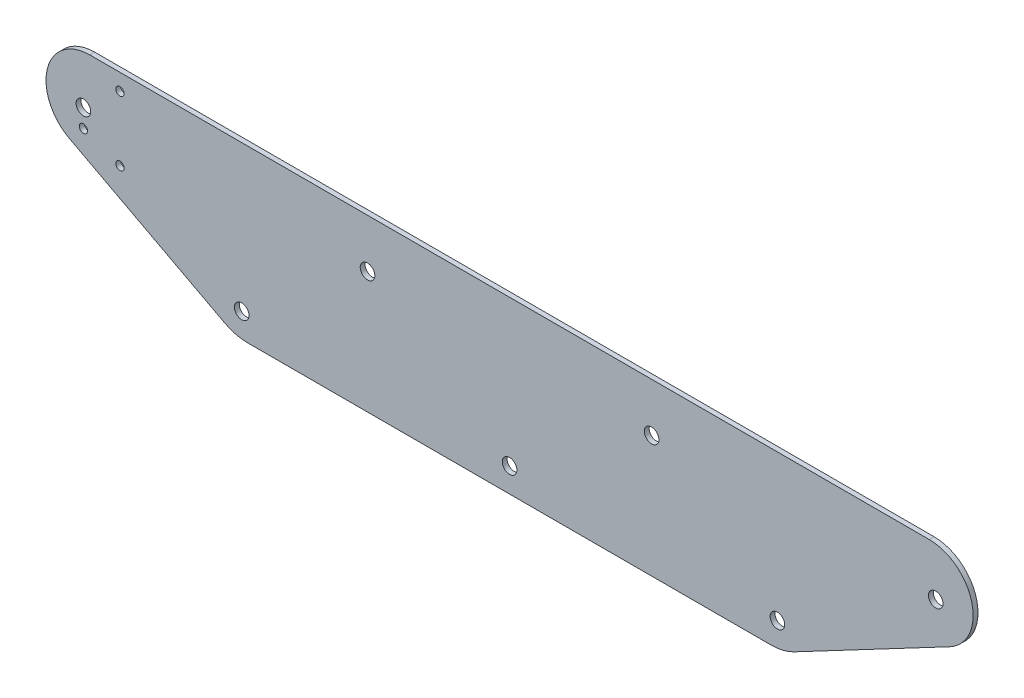
ISO-10303-21;
HEADER;
FILE_DESCRIPTION(('STEP AP214'),'2;1');
FILE_NAME('part.step','',(''),(''),'','','');
FILE_SCHEMA(('AUTOMOTIVE_DESIGN { 1 0 10303 214 1 1 1 1 }'));
ENDSEC;
DATA;
#1=APPLICATION_CONTEXT('core data for automotive mechanical design processes');
#2=APPLICATION_PROTOCOL_DEFINITION('international standard','automotive_design',2000,#1);
#3=PRODUCT_CONTEXT('',#1,'mechanical');
#4=PRODUCT('Part','Part','',(#3));
#5=PRODUCT_RELATED_PRODUCT_CATEGORY('part','',(#4));
#6=PRODUCT_DEFINITION_FORMATION('','',#4);
#7=PRODUCT_DEFINITION_CONTEXT('part definition',#1,'design');
#8=PRODUCT_DEFINITION('design','',#6,#7);
#9=PRODUCT_DEFINITION_SHAPE('','',#8);
#10=(LENGTH_UNIT() NAMED_UNIT(*) SI_UNIT(.MILLI.,.METRE.));
#11=(NAMED_UNIT(*) PLANE_ANGLE_UNIT() SI_UNIT($,.RADIAN.));
#12=(NAMED_UNIT(*) SI_UNIT($,.STERADIAN.) SOLID_ANGLE_UNIT());
#13=UNCERTAINTY_MEASURE_WITH_UNIT(LENGTH_MEASURE(1.E-05),#10,'distance_accuracy_value','');
#14=(GEOMETRIC_REPRESENTATION_CONTEXT(3) GLOBAL_UNCERTAINTY_ASSIGNED_CONTEXT((#13)) GLOBAL_UNIT_ASSIGNED_CONTEXT((#10,
#11,#12)) REPRESENTATION_CONTEXT('',''));
#15=CARTESIAN_POINT('',(0.,0.,0.));
#16=DIRECTION('',(0.,0.,1.));
#17=DIRECTION('',(1.,0.,0.));
#18=AXIS2_PLACEMENT_3D('',#15,#16,#17);
#19=CARTESIAN_POINT('',(0.,0.,2.));
#20=DIRECTION('',(0.,0.,-1.));
#21=DIRECTION('',(-1.,0.,0.));
#22=AXIS2_PLACEMENT_3D('',#19,#20,#21);
#23=PLANE('',#22);
#24=CARTESIAN_POINT('',(-160.,33.228756555323,2.));
#25=DIRECTION('',(0.,0.,-1.));
#26=DIRECTION('',(-1.,0.,0.));
#27=AXIS2_PLACEMENT_3D('',#24,#25,#26);
#28=CIRCLE('',#27,1.70000000000001);
#29=CARTESIAN_POINT('',(-161.7,33.228756555323,2.));
#30=VERTEX_POINT('',#29);
#31=EDGE_CURVE('E233',#30,#30,#28,.T.);
#32=ORIENTED_EDGE('',*,*,#31,.T.);
#33=EDGE_LOOP('',(#32));
#34=FACE_BOUND('',#33,.T.);
#35=CARTESIAN_POINT('',(-175.,12.5,2.));
#36=DIRECTION('',(0.,0.,-1.));
#37=DIRECTION('',(-1.,0.,0.));
#38=AXIS2_PLACEMENT_3D('',#35,#36,#37);
#39=CIRCLE('',#38,1.70000000000001);
#40=CARTESIAN_POINT('',(-176.7,12.5,2.));
#41=VERTEX_POINT('',#40);
#42=EDGE_CURVE('E227',#41,#41,#39,.T.);
#43=ORIENTED_EDGE('',*,*,#42,.T.);
#44=EDGE_LOOP('',(#43));
#45=FACE_BOUND('',#44,.T.);
#46=CARTESIAN_POINT('',(-160.,6.77124344467703,2.));
#47=DIRECTION('',(0.,0.,-1.));
#48=DIRECTION('',(-1.,0.,0.));
#49=AXIS2_PLACEMENT_3D('',#46,#47,#48);
#50=CIRCLE('',#49,1.70000000000001);
#51=CARTESIAN_POINT('',(-161.7,6.77124344467703,2.));
#52=VERTEX_POINT('',#51);
#53=EDGE_CURVE('E219',#52,#52,#50,.T.);
#54=ORIENTED_EDGE('',*,*,#53,.T.);
#55=EDGE_LOOP('',(#54));
#56=FACE_BOUND('',#55,.T.);
#57=DIRECTION('',(0.884163522542753,-0.467177552334003,0.));
#58=VECTOR('',#57,1.);
#59=CARTESIAN_POINT('',(-244.958991581617,40.,2.));
#60=LINE('',#59,#58);
#61=CARTESIAN_POINT('',(-180.772782979186,6.08505659423045,2.));
#62=VERTEX_POINT('',#61);
#63=CARTESIAN_POINT('',(-116.864055255872,-27.6832704508551,2.));
#64=VERTEX_POINT('',#63);
#65=EDGE_CURVE('E131',#62,#64,#60,.T.);
#66=ORIENTED_EDGE('',*,*,#65,.T.);
#67=CARTESIAN_POINT('',(-107.520504209191,-10.,2.));
#68=DIRECTION('',(0.,0.,-1.));
#69=DIRECTION('',(-1.,0.,0.));
#70=AXIS2_PLACEMENT_3D('',#67,#68,#69);
#71=CIRCLE('',#70,20.);
#72=CARTESIAN_POINT('',(-107.520504209191,-30.,2.));
#73=VERTEX_POINT('',#72);
#74=EDGE_CURVE('E44',#64,#73,#71,.F.);
#75=ORIENTED_EDGE('',*,*,#74,.T.);
#76=DIRECTION('',(1.,0.,0.));
#77=VECTOR('',#76,1.);
#78=CARTESIAN_POINT('',(-112.479495790809,-30.,2.));
#79=LINE('',#78,#77);
#80=CARTESIAN_POINT('',(107.520504209191,-30.,2.));
#81=VERTEX_POINT('',#80);
#82=EDGE_CURVE('E134',#73,#81,#79,.T.);
#83=ORIENTED_EDGE('',*,*,#82,.T.);
#84=CARTESIAN_POINT('',(107.520504209191,-9.99999999999999,2.));
#85=DIRECTION('',(0.,0.,-1.));
#86=DIRECTION('',(-1.,0.,0.));
#87=AXIS2_PLACEMENT_3D('',#84,#85,#86);
#88=CIRCLE('',#87,20.);
#89=CARTESIAN_POINT('',(116.864055255872,-27.6832704508551,2.));
#90=VERTEX_POINT('',#89);
#91=EDGE_CURVE('E51',#81,#90,#88,.F.);
#92=ORIENTED_EDGE('',*,*,#91,.T.);
#93=DIRECTION('',(0.884163522542753,0.467177552334003,0.));
#94=VECTOR('',#93,1.);
#95=CARTESIAN_POINT('',(244.958991581617,40.,2.));
#96=LINE('',#95,#94);
#97=CARTESIAN_POINT('',(180.772782979186,6.08505659423045,2.));
#98=VERTEX_POINT('',#97);
#99=EDGE_CURVE('E169',#90,#98,#96,.T.);
#100=ORIENTED_EDGE('',*,*,#99,.T.);
#101=CARTESIAN_POINT('',(172.363587037174,22.,2.));
#102=DIRECTION('',(0.,0.,-1.));
#103=DIRECTION('',(-1.,0.,0.));
#104=AXIS2_PLACEMENT_3D('',#101,#102,#103);
#105=CIRCLE('',#104,18.);
#106=CARTESIAN_POINT('',(172.363587037174,40.,2.));
#107=VERTEX_POINT('',#106);
#108=EDGE_CURVE('E145',#98,#107,#105,.F.);
#109=ORIENTED_EDGE('',*,*,#108,.T.);
#110=DIRECTION('',(-1.,0.,0.));
#111=VECTOR('',#110,1.);
#112=CARTESIAN_POINT('',(110.,40.,2.));
#113=LINE('',#112,#111);
#114=CARTESIAN_POINT('',(-172.363587037174,40.,2.));
#115=VERTEX_POINT('',#114);
#116=EDGE_CURVE('E124',#107,#115,#113,.T.);
#117=ORIENTED_EDGE('',*,*,#116,.T.);
#118=CARTESIAN_POINT('',(-172.363587037174,22.,2.));
#119=DIRECTION('',(0.,0.,-1.));
#120=DIRECTION('',(-1.,0.,0.));
#121=AXIS2_PLACEMENT_3D('',#118,#119,#120);
#122=CIRCLE('',#121,18.);
#123=EDGE_CURVE('E143',#115,#62,#122,.F.);
#124=ORIENTED_EDGE('',*,*,#123,.T.);
#125=EDGE_LOOP('',(#66,#75,#83,#92,#100,#109,#117,#124));
#126=FACE_BOUND('',#125,.T.);
#127=CARTESIAN_POINT('',(0.,-20.,2.));
#128=DIRECTION('',(0.,0.,1.));
#129=DIRECTION('',(1.,0.,0.));
#130=AXIS2_PLACEMENT_3D('',#127,#128,#129);
#131=CIRCLE('',#130,3.);
#132=CARTESIAN_POINT('',(3.00000000000003,-20.,2.));
#133=VERTEX_POINT('',#132);
#134=EDGE_CURVE('E175',#133,#133,#131,.T.);
#135=ORIENTED_EDGE('',*,*,#134,.F.);
#136=EDGE_LOOP('',(#135));
#137=FACE_BOUND('',#136,.T.);
#138=CARTESIAN_POINT('',(-175.,20.,2.));
#139=DIRECTION('',(0.,0.,1.));
#140=DIRECTION('',(1.,0.,0.));
#141=AXIS2_PLACEMENT_3D('',#138,#139,#140);
#142=CIRCLE('',#141,2.99999999999999);
#143=CARTESIAN_POINT('',(-172.,20.,2.));
#144=VERTEX_POINT('',#143);
#145=EDGE_CURVE('E184',#144,#144,#142,.T.);
#146=ORIENTED_EDGE('',*,*,#145,.F.);
#147=EDGE_LOOP('',(#146));
#148=FACE_BOUND('',#147,.T.);
#149=CARTESIAN_POINT('',(-110.,-20.,2.));
#150=DIRECTION('',(0.,0.,1.));
#151=DIRECTION('',(1.,0.,0.));
#152=AXIS2_PLACEMENT_3D('',#149,#150,#151);
#153=CIRCLE('',#152,3.00000000000001);
#154=CARTESIAN_POINT('',(-107.,-20.,2.));
#155=VERTEX_POINT('',#154);
#156=EDGE_CURVE('E189',#155,#155,#153,.T.);
#157=ORIENTED_EDGE('',*,*,#156,.F.);
#158=EDGE_LOOP('',(#157));
#159=FACE_BOUND('',#158,.T.);
#160=CARTESIAN_POINT('',(110.,-20.,2.));
#161=DIRECTION('',(0.,0.,1.));
#162=DIRECTION('',(1.,0.,0.));
#163=AXIS2_PLACEMENT_3D('',#160,#161,#162);
#164=CIRCLE('',#163,3.00000000000001);
#165=CARTESIAN_POINT('',(113.,-20.,2.));
#166=VERTEX_POINT('',#165);
#167=EDGE_CURVE('E195',#166,#166,#164,.T.);
#168=ORIENTED_EDGE('',*,*,#167,.F.);
#169=EDGE_LOOP('',(#168));
#170=FACE_BOUND('',#169,.T.);
#171=CARTESIAN_POINT('',(175.,20.,2.));
#172=DIRECTION('',(0.,0.,1.));
#173=DIRECTION('',(1.,0.,0.));
#174=AXIS2_PLACEMENT_3D('',#171,#172,#173);
#175=CIRCLE('',#174,2.99999999999999);
#176=CARTESIAN_POINT('',(178.,20.,2.));
#177=VERTEX_POINT('',#176);
#178=EDGE_CURVE('E201',#177,#177,#175,.T.);
#179=ORIENTED_EDGE('',*,*,#178,.F.);
#180=EDGE_LOOP('',(#179));
#181=FACE_BOUND('',#180,.T.);
#182=CARTESIAN_POINT('',(-58.3333333333333,20.,2.));
#183=DIRECTION('',(0.,0.,1.));
#184=DIRECTION('',(1.,0.,0.));
#185=AXIS2_PLACEMENT_3D('',#182,#183,#184);
#186=CIRCLE('',#185,3.);
#187=CARTESIAN_POINT('',(-55.3333333333333,20.,2.));
#188=VERTEX_POINT('',#187);
#189=EDGE_CURVE('E207',#188,#188,#186,.T.);
#190=ORIENTED_EDGE('',*,*,#189,.F.);
#191=EDGE_LOOP('',(#190));
#192=FACE_BOUND('',#191,.T.);
#193=CARTESIAN_POINT('',(58.3333333333334,20.,2.));
#194=DIRECTION('',(0.,0.,1.));
#195=DIRECTION('',(1.,0.,0.));
#196=AXIS2_PLACEMENT_3D('',#193,#194,#195);
#197=CIRCLE('',#196,3.00000000000001);
#198=CARTESIAN_POINT('',(61.3333333333334,20.,2.));
#199=VERTEX_POINT('',#198);
#200=EDGE_CURVE('E213',#199,#199,#197,.T.);
#201=ORIENTED_EDGE('',*,*,#200,.F.);
#202=EDGE_LOOP('',(#201));
#203=FACE_BOUND('',#202,.T.);
#204=ADVANCED_FACE('F36',(#34,#45,#56,#126,#137,#148,#159,#170,#181,#192,#203),#23,.F.);
#205=CARTESIAN_POINT('',(0.,0.,0.));
#206=DIRECTION('',(0.,0.,-1.));
#207=DIRECTION('',(-1.,0.,0.));
#208=AXIS2_PLACEMENT_3D('',#205,#206,#207);
#209=PLANE('',#208);
#210=CARTESIAN_POINT('',(-160.,33.228756555323,0.));
#211=DIRECTION('',(0.,0.,-1.));
#212=DIRECTION('',(-1.,0.,0.));
#213=AXIS2_PLACEMENT_3D('',#210,#211,#212);
#214=CIRCLE('',#213,1.69999999999998);
#215=CARTESIAN_POINT('',(-161.7,33.228756555323,0.));
#216=VERTEX_POINT('',#215);
#217=EDGE_CURVE('E236',#216,#216,#214,.T.);
#218=ORIENTED_EDGE('',*,*,#217,.F.);
#219=EDGE_LOOP('',(#218));
#220=FACE_BOUND('',#219,.T.);
#221=CARTESIAN_POINT('',(-175.,12.5,0.));
#222=DIRECTION('',(0.,0.,-1.));
#223=DIRECTION('',(-1.,0.,0.));
#224=AXIS2_PLACEMENT_3D('',#221,#222,#223);
#225=CIRCLE('',#224,1.69999999999998);
#226=CARTESIAN_POINT('',(-176.7,12.5,0.));
#227=VERTEX_POINT('',#226);
#228=EDGE_CURVE('E230',#227,#227,#225,.T.);
#229=ORIENTED_EDGE('',*,*,#228,.F.);
#230=EDGE_LOOP('',(#229));
#231=FACE_BOUND('',#230,.T.);
#232=CARTESIAN_POINT('',(-160.,6.77124344467703,0.));
#233=DIRECTION('',(0.,0.,-1.));
#234=DIRECTION('',(-1.,0.,0.));
#235=AXIS2_PLACEMENT_3D('',#232,#233,#234);
#236=CIRCLE('',#235,1.69999999999998);
#237=CARTESIAN_POINT('',(-161.7,6.77124344467703,0.));
#238=VERTEX_POINT('',#237);
#239=EDGE_CURVE('E224',#238,#238,#236,.T.);
#240=ORIENTED_EDGE('',*,*,#239,.F.);
#241=EDGE_LOOP('',(#240));
#242=FACE_BOUND('',#241,.T.);
#243=CARTESIAN_POINT('',(-58.3333333333333,20.,0.));
#244=DIRECTION('',(0.,0.,1.));
#245=DIRECTION('',(1.,0.,0.));
#246=AXIS2_PLACEMENT_3D('',#243,#244,#245);
#247=CIRCLE('',#246,3.);
#248=CARTESIAN_POINT('',(-55.3333333333333,20.,0.));
#249=VERTEX_POINT('',#248);
#250=EDGE_CURVE('E210',#249,#249,#247,.T.);
#251=ORIENTED_EDGE('',*,*,#250,.T.);
#252=EDGE_LOOP('',(#251));
#253=FACE_BOUND('',#252,.T.);
#254=CARTESIAN_POINT('',(110.,-20.,0.));
#255=DIRECTION('',(0.,0.,1.));
#256=DIRECTION('',(1.,0.,0.));
#257=AXIS2_PLACEMENT_3D('',#254,#255,#256);
#258=CIRCLE('',#257,3.00000000000001);
#259=CARTESIAN_POINT('',(113.,-20.,0.));
#260=VERTEX_POINT('',#259);
#261=EDGE_CURVE('E198',#260,#260,#258,.T.);
#262=ORIENTED_EDGE('',*,*,#261,.T.);
#263=EDGE_LOOP('',(#262));
#264=FACE_BOUND('',#263,.T.);
#265=CARTESIAN_POINT('',(-175.,20.,0.));
#266=DIRECTION('',(0.,0.,1.));
#267=DIRECTION('',(1.,0.,0.));
#268=AXIS2_PLACEMENT_3D('',#265,#266,#267);
#269=CIRCLE('',#268,2.99999999999999);
#270=CARTESIAN_POINT('',(-172.,20.,0.));
#271=VERTEX_POINT('',#270);
#272=EDGE_CURVE('E186',#271,#271,#269,.T.);
#273=ORIENTED_EDGE('',*,*,#272,.T.);
#274=EDGE_LOOP('',(#273));
#275=FACE_BOUND('',#274,.T.);
#276=DIRECTION('',(1.,0.,0.));
#277=VECTOR('',#276,1.);
#278=CARTESIAN_POINT('',(-112.479495790809,-30.,0.));
#279=LINE('',#278,#277);
#280=CARTESIAN_POINT('',(-107.520504209191,-30.,0.));
#281=VERTEX_POINT('',#280);
#282=CARTESIAN_POINT('',(107.520504209191,-30.,0.));
#283=VERTEX_POINT('',#282);
#284=EDGE_CURVE('E136',#281,#283,#279,.T.);
#285=ORIENTED_EDGE('',*,*,#284,.F.);
#286=CARTESIAN_POINT('',(-107.520504209191,-10.,0.));
#287=DIRECTION('',(0.,0.,-1.));
#288=DIRECTION('',(-1.,0.,0.));
#289=AXIS2_PLACEMENT_3D('',#286,#287,#288);
#290=CIRCLE('',#289,20.);
#291=CARTESIAN_POINT('',(-116.864055255872,-27.6832704508551,0.));
#292=VERTEX_POINT('',#291);
#293=EDGE_CURVE('E157',#281,#292,#290,.T.);
#294=ORIENTED_EDGE('',*,*,#293,.T.);
#295=DIRECTION('',(0.884163522542753,-0.467177552334003,0.));
#296=VECTOR('',#295,1.);
#297=CARTESIAN_POINT('',(-244.958991581617,40.,0.));
#298=LINE('',#297,#296);
#299=CARTESIAN_POINT('',(-180.772782979186,6.08505659423045,0.));
#300=VERTEX_POINT('',#299);
#301=EDGE_CURVE('E172',#300,#292,#298,.T.);
#302=ORIENTED_EDGE('',*,*,#301,.F.);
#303=CARTESIAN_POINT('',(-172.363587037174,22.,0.));
#304=DIRECTION('',(0.,0.,-1.));
#305=DIRECTION('',(-1.,0.,0.));
#306=AXIS2_PLACEMENT_3D('',#303,#304,#305);
#307=CIRCLE('',#306,18.);
#308=CARTESIAN_POINT('',(-172.363587037174,40.,0.));
#309=VERTEX_POINT('',#308);
#310=EDGE_CURVE('E115',#300,#309,#307,.T.);
#311=ORIENTED_EDGE('',*,*,#310,.T.);
#312=DIRECTION('',(-1.,0.,0.));
#313=VECTOR('',#312,1.);
#314=CARTESIAN_POINT('',(-244.958991581617,40.,0.));
#315=LINE('',#314,#313);
#316=CARTESIAN_POINT('',(172.363587037174,40.,0.));
#317=VERTEX_POINT('',#316);
#318=EDGE_CURVE('E121',#317,#309,#315,.T.);
#319=ORIENTED_EDGE('',*,*,#318,.F.);
#320=CARTESIAN_POINT('',(172.363587037174,22.,0.));
#321=DIRECTION('',(0.,0.,-1.));
#322=DIRECTION('',(-1.,0.,0.));
#323=AXIS2_PLACEMENT_3D('',#320,#321,#322);
#324=CIRCLE('',#323,18.);
#325=CARTESIAN_POINT('',(180.772782979186,6.08505659423045,0.));
#326=VERTEX_POINT('',#325);
#327=EDGE_CURVE('E105',#317,#326,#324,.T.);
#328=ORIENTED_EDGE('',*,*,#327,.T.);
#329=DIRECTION('',(0.884163522542753,0.467177552334003,0.));
#330=VECTOR('',#329,1.);
#331=CARTESIAN_POINT('',(244.958991581617,40.,0.));
#332=LINE('',#331,#330);
#333=CARTESIAN_POINT('',(116.864055255872,-27.6832704508551,0.));
#334=VERTEX_POINT('',#333);
#335=EDGE_CURVE('E132',#334,#326,#332,.T.);
#336=ORIENTED_EDGE('',*,*,#335,.F.);
#337=CARTESIAN_POINT('',(107.520504209191,-9.99999999999999,0.));
#338=DIRECTION('',(0.,0.,-1.));
#339=DIRECTION('',(-1.,0.,0.));
#340=AXIS2_PLACEMENT_3D('',#337,#338,#339);
#341=CIRCLE('',#340,20.);
#342=EDGE_CURVE('E155',#334,#283,#341,.T.);
#343=ORIENTED_EDGE('',*,*,#342,.T.);
#344=EDGE_LOOP('',(#285,#294,#302,#311,#319,#328,#336,#343));
#345=FACE_BOUND('',#344,.T.);
#346=CARTESIAN_POINT('',(0.,-20.,0.));
#347=DIRECTION('',(0.,0.,1.));
#348=DIRECTION('',(1.,0.,0.));
#349=AXIS2_PLACEMENT_3D('',#346,#347,#348);
#350=CIRCLE('',#349,3.);
#351=CARTESIAN_POINT('',(3.00000000000003,-20.,0.));
#352=VERTEX_POINT('',#351);
#353=EDGE_CURVE('E178',#352,#352,#350,.T.);
#354=ORIENTED_EDGE('',*,*,#353,.T.);
#355=EDGE_LOOP('',(#354));
#356=FACE_BOUND('',#355,.T.);
#357=CARTESIAN_POINT('',(-110.,-20.,0.));
#358=DIRECTION('',(0.,0.,1.));
#359=DIRECTION('',(1.,0.,0.));
#360=AXIS2_PLACEMENT_3D('',#357,#358,#359);
#361=CIRCLE('',#360,3.00000000000001);
#362=CARTESIAN_POINT('',(-107.,-20.,0.));
#363=VERTEX_POINT('',#362);
#364=EDGE_CURVE('E192',#363,#363,#361,.T.);
#365=ORIENTED_EDGE('',*,*,#364,.T.);
#366=EDGE_LOOP('',(#365));
#367=FACE_BOUND('',#366,.T.);
#368=CARTESIAN_POINT('',(175.,20.,0.));
#369=DIRECTION('',(0.,0.,1.));
#370=DIRECTION('',(1.,0.,0.));
#371=AXIS2_PLACEMENT_3D('',#368,#369,#370);
#372=CIRCLE('',#371,2.99999999999999);
#373=CARTESIAN_POINT('',(178.,20.,0.));
#374=VERTEX_POINT('',#373);
#375=EDGE_CURVE('E204',#374,#374,#372,.T.);
#376=ORIENTED_EDGE('',*,*,#375,.T.);
#377=EDGE_LOOP('',(#376));
#378=FACE_BOUND('',#377,.T.);
#379=CARTESIAN_POINT('',(58.3333333333334,20.,0.));
#380=DIRECTION('',(0.,0.,1.));
#381=DIRECTION('',(1.,0.,0.));
#382=AXIS2_PLACEMENT_3D('',#379,#380,#381);
#383=CIRCLE('',#382,3.00000000000001);
#384=CARTESIAN_POINT('',(61.3333333333334,20.,0.));
#385=VERTEX_POINT('',#384);
#386=EDGE_CURVE('E216',#385,#385,#383,.T.);
#387=ORIENTED_EDGE('',*,*,#386,.T.);
#388=EDGE_LOOP('',(#387));
#389=FACE_BOUND('',#388,.T.);
#390=ADVANCED_FACE('F128',(#220,#231,#242,#253,#264,#275,#345,#356,#367,#378,#389),#209,.T.);
#391=CARTESIAN_POINT('',(-244.958991581617,40.,2.));
#392=DIRECTION('',(0.467177552334003,0.884163522542753,0.));
#393=DIRECTION('',(-0.884163522542753,0.467177552334003,0.));
#394=AXIS2_PLACEMENT_3D('',#391,#392,#393);
#395=PLANE('',#394);
#396=ORIENTED_EDGE('',*,*,#301,.T.);
#397=DIRECTION('',(0.,0.,-1.));
#398=VECTOR('',#397,1.);
#399=CARTESIAN_POINT('',(-116.864055255872,-27.6832704508551,2.));
#400=LINE('',#399,#398);
#401=EDGE_CURVE('E59',#292,#64,#400,.F.);
#402=ORIENTED_EDGE('',*,*,#401,.T.);
#403=ORIENTED_EDGE('',*,*,#65,.F.);
#404=DIRECTION('',(0.,0.,-1.));
#405=VECTOR('',#404,1.);
#406=CARTESIAN_POINT('',(-180.772782979186,6.08505659423045,2.));
#407=LINE('',#406,#405);
#408=EDGE_CURVE('E147',#62,#300,#407,.T.);
#409=ORIENTED_EDGE('',*,*,#408,.T.);
#410=EDGE_LOOP('',(#396,#402,#403,#409));
#411=FACE_BOUND('',#410,.T.);
#412=ADVANCED_FACE('F173',(#411),#395,.F.);
#413=CARTESIAN_POINT('',(-112.479495790809,-30.,2.));
#414=DIRECTION('',(0.,1.,0.));
#415=DIRECTION('',(0.,0.,1.));
#416=AXIS2_PLACEMENT_3D('',#413,#414,#415);
#417=PLANE('',#416);
#418=ORIENTED_EDGE('',*,*,#82,.F.);
#419=DIRECTION('',(0.,0.,-1.));
#420=VECTOR('',#419,1.);
#421=CARTESIAN_POINT('',(-107.520504209191,-30.,2.));
#422=LINE('',#421,#420);
#423=EDGE_CURVE('E152',#73,#281,#422,.T.);
#424=ORIENTED_EDGE('',*,*,#423,.T.);
#425=ORIENTED_EDGE('',*,*,#284,.T.);
#426=DIRECTION('',(0.,0.,-1.));
#427=VECTOR('',#426,1.);
#428=CARTESIAN_POINT('',(107.520504209191,-30.,2.));
#429=LINE('',#428,#427);
#430=EDGE_CURVE('E150',#283,#81,#429,.F.);
#431=ORIENTED_EDGE('',*,*,#430,.T.);
#432=EDGE_LOOP('',(#418,#424,#425,#431));
#433=FACE_BOUND('',#432,.T.);
#434=ADVANCED_FACE('F166',(#433),#417,.F.);
#435=CARTESIAN_POINT('',(244.958991581617,40.,2.));
#436=DIRECTION('',(-0.467177552334003,0.884163522542753,0.));
#437=DIRECTION('',(-0.884163522542753,-0.467177552334003,0.));
#438=AXIS2_PLACEMENT_3D('',#435,#436,#437);
#439=PLANE('',#438);
#440=ORIENTED_EDGE('',*,*,#99,.F.);
#441=DIRECTION('',(0.,0.,-1.));
#442=VECTOR('',#441,1.);
#443=CARTESIAN_POINT('',(116.864055255872,-27.6832704508551,2.));
#444=LINE('',#443,#442);
#445=EDGE_CURVE('E11',#90,#334,#444,.T.);
#446=ORIENTED_EDGE('',*,*,#445,.T.);
#447=ORIENTED_EDGE('',*,*,#335,.T.);
#448=DIRECTION('',(0.,0.,-1.));
#449=VECTOR('',#448,1.);
#450=CARTESIAN_POINT('',(180.772782979186,6.08505659423045,2.));
#451=LINE('',#450,#449);
#452=EDGE_CURVE('E111',#326,#98,#451,.F.);
#453=ORIENTED_EDGE('',*,*,#452,.T.);
#454=EDGE_LOOP('',(#440,#446,#447,#453));
#455=FACE_BOUND('',#454,.T.);
#456=ADVANCED_FACE('F279',(#455),#439,.F.);
#457=CARTESIAN_POINT('',(-244.958991581617,40.,2.));
#458=DIRECTION('',(0.,-1.,0.));
#459=DIRECTION('',(0.,0.,-1.));
#460=AXIS2_PLACEMENT_3D('',#457,#458,#459);
#461=PLANE('',#460);
#462=ORIENTED_EDGE('',*,*,#116,.F.);
#463=DIRECTION('',(0.,0.,-1.));
#464=VECTOR('',#463,1.);
#465=CARTESIAN_POINT('',(172.363587037174,40.,2.));
#466=LINE('',#465,#464);
#467=EDGE_CURVE('E109',#107,#317,#466,.T.);
#468=ORIENTED_EDGE('',*,*,#467,.T.);
#469=ORIENTED_EDGE('',*,*,#318,.T.);
#470=DIRECTION('',(0.,0.,-1.));
#471=VECTOR('',#470,1.);
#472=CARTESIAN_POINT('',(-172.363587037174,40.,2.));
#473=LINE('',#472,#471);
#474=EDGE_CURVE('E125',#309,#115,#473,.F.);
#475=ORIENTED_EDGE('',*,*,#474,.T.);
#476=EDGE_LOOP('',(#462,#468,#469,#475));
#477=FACE_BOUND('',#476,.T.);
#478=ADVANCED_FACE('F120',(#477),#461,.F.);
#479=CARTESIAN_POINT('',(0.,-20.,2.));
#480=DIRECTION('',(0.,0.,-1.));
#481=DIRECTION('',(-1.,0.,0.));
#482=AXIS2_PLACEMENT_3D('',#479,#480,#481);
#483=CYLINDRICAL_SURFACE('',#482,3.);
#484=ORIENTED_EDGE('',*,*,#134,.T.);
#485=EDGE_LOOP('',(#484));
#486=FACE_BOUND('',#485,.T.);
#487=ORIENTED_EDGE('',*,*,#353,.F.);
#488=EDGE_LOOP('',(#487));
#489=FACE_BOUND('',#488,.T.);
#490=ADVANCED_FACE('F258',(#486,#489),#483,.F.);
#491=CARTESIAN_POINT('',(-175.,20.,2.));
#492=DIRECTION('',(0.,0.,-1.));
#493=DIRECTION('',(-1.,0.,0.));
#494=AXIS2_PLACEMENT_3D('',#491,#492,#493);
#495=CYLINDRICAL_SURFACE('',#494,2.99999999999999);
#496=ORIENTED_EDGE('',*,*,#145,.T.);
#497=EDGE_LOOP('',(#496));
#498=FACE_BOUND('',#497,.T.);
#499=ORIENTED_EDGE('',*,*,#272,.F.);
#500=EDGE_LOOP('',(#499));
#501=FACE_BOUND('',#500,.T.);
#502=ADVANCED_FACE('F255',(#498,#501),#495,.F.);
#503=CARTESIAN_POINT('',(-110.,-20.,2.));
#504=DIRECTION('',(0.,0.,-1.));
#505=DIRECTION('',(-1.,0.,0.));
#506=AXIS2_PLACEMENT_3D('',#503,#504,#505);
#507=CYLINDRICAL_SURFACE('',#506,3.00000000000001);
#508=ORIENTED_EDGE('',*,*,#156,.T.);
#509=EDGE_LOOP('',(#508));
#510=FACE_BOUND('',#509,.T.);
#511=ORIENTED_EDGE('',*,*,#364,.F.);
#512=EDGE_LOOP('',(#511));
#513=FACE_BOUND('',#512,.T.);
#514=ADVANCED_FACE('F257',(#510,#513),#507,.F.);
#515=CARTESIAN_POINT('',(110.,-20.,2.));
#516=DIRECTION('',(0.,0.,-1.));
#517=DIRECTION('',(-1.,0.,0.));
#518=AXIS2_PLACEMENT_3D('',#515,#516,#517);
#519=CYLINDRICAL_SURFACE('',#518,3.00000000000001);
#520=ORIENTED_EDGE('',*,*,#167,.T.);
#521=EDGE_LOOP('',(#520));
#522=FACE_BOUND('',#521,.T.);
#523=ORIENTED_EDGE('',*,*,#261,.F.);
#524=EDGE_LOOP('',(#523));
#525=FACE_BOUND('',#524,.T.);
#526=ADVANCED_FACE('F265',(#522,#525),#519,.F.);
#527=CARTESIAN_POINT('',(175.,20.,2.));
#528=DIRECTION('',(0.,0.,-1.));
#529=DIRECTION('',(-1.,0.,0.));
#530=AXIS2_PLACEMENT_3D('',#527,#528,#529);
#531=CYLINDRICAL_SURFACE('',#530,2.99999999999999);
#532=ORIENTED_EDGE('',*,*,#178,.T.);
#533=EDGE_LOOP('',(#532));
#534=FACE_BOUND('',#533,.T.);
#535=ORIENTED_EDGE('',*,*,#375,.F.);
#536=EDGE_LOOP('',(#535));
#537=FACE_BOUND('',#536,.T.);
#538=ADVANCED_FACE('F322',(#534,#537),#531,.F.);
#539=CARTESIAN_POINT('',(-58.3333333333333,20.,2.));
#540=DIRECTION('',(0.,0.,-1.));
#541=DIRECTION('',(-1.,0.,0.));
#542=AXIS2_PLACEMENT_3D('',#539,#540,#541);
#543=CYLINDRICAL_SURFACE('',#542,3.);
#544=ORIENTED_EDGE('',*,*,#189,.T.);
#545=EDGE_LOOP('',(#544));
#546=FACE_BOUND('',#545,.T.);
#547=ORIENTED_EDGE('',*,*,#250,.F.);
#548=EDGE_LOOP('',(#547));
#549=FACE_BOUND('',#548,.T.);
#550=ADVANCED_FACE('F318',(#546,#549),#543,.F.);
#551=CARTESIAN_POINT('',(58.3333333333334,20.,2.));
#552=DIRECTION('',(0.,0.,-1.));
#553=DIRECTION('',(-1.,0.,0.));
#554=AXIS2_PLACEMENT_3D('',#551,#552,#553);
#555=CYLINDRICAL_SURFACE('',#554,3.00000000000001);
#556=ORIENTED_EDGE('',*,*,#200,.T.);
#557=EDGE_LOOP('',(#556));
#558=FACE_BOUND('',#557,.T.);
#559=ORIENTED_EDGE('',*,*,#386,.F.);
#560=EDGE_LOOP('',(#559));
#561=FACE_BOUND('',#560,.T.);
#562=ADVANCED_FACE('F290',(#558,#561),#555,.F.);
#563=CARTESIAN_POINT('',(172.363587037174,22.,2.));
#564=DIRECTION('',(0.,0.,-1.));
#565=DIRECTION('',(-1.,0.,0.));
#566=AXIS2_PLACEMENT_3D('',#563,#564,#565);
#567=CYLINDRICAL_SURFACE('',#566,18.);
#568=ORIENTED_EDGE('',*,*,#108,.F.);
#569=ORIENTED_EDGE('',*,*,#452,.F.);
#570=ORIENTED_EDGE('',*,*,#327,.F.);
#571=ORIENTED_EDGE('',*,*,#467,.F.);
#572=EDGE_LOOP('',(#568,#569,#570,#571));
#573=FACE_BOUND('',#572,.T.);
#574=ADVANCED_FACE('F108',(#573),#567,.T.);
#575=CARTESIAN_POINT('',(-172.363587037174,22.,2.));
#576=DIRECTION('',(0.,0.,-1.));
#577=DIRECTION('',(-1.,0.,0.));
#578=AXIS2_PLACEMENT_3D('',#575,#576,#577);
#579=CYLINDRICAL_SURFACE('',#578,18.);
#580=ORIENTED_EDGE('',*,*,#123,.F.);
#581=ORIENTED_EDGE('',*,*,#474,.F.);
#582=ORIENTED_EDGE('',*,*,#310,.F.);
#583=ORIENTED_EDGE('',*,*,#408,.F.);
#584=EDGE_LOOP('',(#580,#581,#582,#583));
#585=FACE_BOUND('',#584,.T.);
#586=ADVANCED_FACE('F289',(#585),#579,.T.);
#587=CARTESIAN_POINT('',(-107.520504209191,-10.,2.));
#588=DIRECTION('',(0.,0.,-1.));
#589=DIRECTION('',(-1.,0.,0.));
#590=AXIS2_PLACEMENT_3D('',#587,#588,#589);
#591=CYLINDRICAL_SURFACE('',#590,20.);
#592=ORIENTED_EDGE('',*,*,#74,.F.);
#593=ORIENTED_EDGE('',*,*,#401,.F.);
#594=ORIENTED_EDGE('',*,*,#293,.F.);
#595=ORIENTED_EDGE('',*,*,#423,.F.);
#596=EDGE_LOOP('',(#592,#593,#594,#595));
#597=FACE_BOUND('',#596,.T.);
#598=ADVANCED_FACE('F171',(#597),#591,.T.);
#599=CARTESIAN_POINT('',(107.520504209191,-9.99999999999999,2.));
#600=DIRECTION('',(0.,0.,-1.));
#601=DIRECTION('',(-1.,0.,0.));
#602=AXIS2_PLACEMENT_3D('',#599,#600,#601);
#603=CYLINDRICAL_SURFACE('',#602,20.);
#604=ORIENTED_EDGE('',*,*,#91,.F.);
#605=ORIENTED_EDGE('',*,*,#430,.F.);
#606=ORIENTED_EDGE('',*,*,#342,.F.);
#607=ORIENTED_EDGE('',*,*,#445,.F.);
#608=EDGE_LOOP('',(#604,#605,#606,#607));
#609=FACE_BOUND('',#608,.T.);
#610=ADVANCED_FACE('F38',(#609),#603,.T.);
#611=CARTESIAN_POINT('',(-160.,6.77124344467703,0.));
#612=DIRECTION('',(0.,0.,-1.));
#613=DIRECTION('',(-1.,0.,0.));
#614=AXIS2_PLACEMENT_3D('',#611,#612,#613);
#615=CYLINDRICAL_SURFACE('',#614,1.69999999999999);
#616=ORIENTED_EDGE('',*,*,#53,.F.);
#617=EDGE_LOOP('',(#616));
#618=FACE_BOUND('',#617,.T.);
#619=ORIENTED_EDGE('',*,*,#239,.T.);
#620=EDGE_LOOP('',(#619));
#621=FACE_BOUND('',#620,.T.);
#622=ADVANCED_FACE('F297',(#618,#621),#615,.F.);
#623=CARTESIAN_POINT('',(-175.,12.5,0.));
#624=DIRECTION('',(0.,0.,-1.));
#625=DIRECTION('',(-1.,0.,0.));
#626=AXIS2_PLACEMENT_3D('',#623,#624,#625);
#627=CYLINDRICAL_SURFACE('',#626,1.69999999999999);
#628=ORIENTED_EDGE('',*,*,#42,.F.);
#629=EDGE_LOOP('',(#628));
#630=FACE_BOUND('',#629,.T.);
#631=ORIENTED_EDGE('',*,*,#228,.T.);
#632=EDGE_LOOP('',(#631));
#633=FACE_BOUND('',#632,.T.);
#634=ADVANCED_FACE('F302',(#630,#633),#627,.F.);
#635=CARTESIAN_POINT('',(-160.,33.228756555323,0.));
#636=DIRECTION('',(0.,0.,-1.));
#637=DIRECTION('',(-1.,0.,0.));
#638=AXIS2_PLACEMENT_3D('',#635,#636,#637);
#639=CYLINDRICAL_SURFACE('',#638,1.69999999999999);
#640=ORIENTED_EDGE('',*,*,#31,.F.);
#641=EDGE_LOOP('',(#640));
#642=FACE_BOUND('',#641,.T.);
#643=ORIENTED_EDGE('',*,*,#217,.T.);
#644=EDGE_LOOP('',(#643));
#645=FACE_BOUND('',#644,.T.);
#646=ADVANCED_FACE('F240',(#642,#645),#639,.F.);
#647=CLOSED_SHELL('',(#204,#390,#412,#434,#456,#478,#490,#502,#514,#526,#538,#550,#562,#574,
#586,#598,#610,#622,#634,#646));
#648=MANIFOLD_SOLID_BREP('B2',#647);
#649=ADVANCED_BREP_SHAPE_REPRESENTATION('',(#18,#648),#14);
#650=SHAPE_DEFINITION_REPRESENTATION(#9,#649);
ENDSEC;
END-ISO-10303-21;
